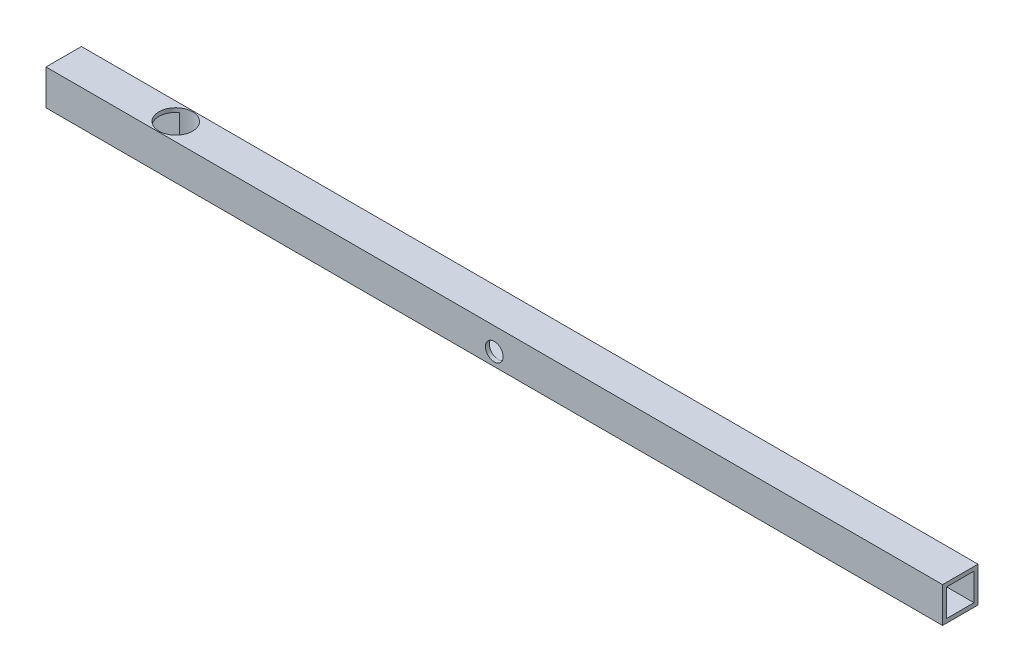
ISO-10303-21;
HEADER;
FILE_DESCRIPTION(('STEP AP214'),'2;1');
FILE_NAME('part.step','',(''),(''),'','','');
FILE_SCHEMA(('AUTOMOTIVE_DESIGN { 1 0 10303 214 1 1 1 1 }'));
ENDSEC;
DATA;
#1=APPLICATION_CONTEXT('core data for automotive mechanical design processes');
#2=APPLICATION_PROTOCOL_DEFINITION('international standard','automotive_design',2000,#1);
#3=PRODUCT_CONTEXT('',#1,'mechanical');
#4=PRODUCT('Part','Part','',(#3));
#5=PRODUCT_RELATED_PRODUCT_CATEGORY('part','',(#4));
#6=PRODUCT_DEFINITION_FORMATION('','',#4);
#7=PRODUCT_DEFINITION_CONTEXT('part definition',#1,'design');
#8=PRODUCT_DEFINITION('design','',#6,#7);
#9=PRODUCT_DEFINITION_SHAPE('','',#8);
#10=(LENGTH_UNIT() NAMED_UNIT(*) SI_UNIT(.MILLI.,.METRE.));
#11=(NAMED_UNIT(*) PLANE_ANGLE_UNIT() SI_UNIT($,.RADIAN.));
#12=(NAMED_UNIT(*) SI_UNIT($,.STERADIAN.) SOLID_ANGLE_UNIT());
#13=UNCERTAINTY_MEASURE_WITH_UNIT(LENGTH_MEASURE(1.E-05),#10,'distance_accuracy_value','');
#14=(GEOMETRIC_REPRESENTATION_CONTEXT(3) GLOBAL_UNCERTAINTY_ASSIGNED_CONTEXT((#13)) GLOBAL_UNIT_ASSIGNED_CONTEXT((#10,
#11,#12)) REPRESENTATION_CONTEXT('',''));
#15=CARTESIAN_POINT('',(0.,0.,0.));
#16=DIRECTION('',(0.,0.,1.));
#17=DIRECTION('',(1.,0.,0.));
#18=AXIS2_PLACEMENT_3D('',#15,#16,#17);
#19=CARTESIAN_POINT('',(80.,0.36,-0.36));
#20=DIRECTION('',(0.,0.,-1.));
#21=DIRECTION('',(-1.,0.,0.));
#22=AXIS2_PLACEMENT_3D('',#19,#20,#21);
#23=PLANE('',#22);
#24=DIRECTION('',(0.,1.,0.));
#25=VECTOR('',#24,1.);
#26=CARTESIAN_POINT('',(9.12730303082914,0.,-0.36));
#27=LINE('',#26,#25);
#28=CARTESIAN_POINT('',(9.12730303082914,0.36,-0.36));
#29=VERTEX_POINT('',#28);
#30=CARTESIAN_POINT('',(9.12730303082914,2.8,-0.36));
#31=VERTEX_POINT('',#30);
#32=EDGE_CURVE('E47',#29,#31,#27,.T.);
#33=ORIENTED_EDGE('',*,*,#32,.F.);
#34=DIRECTION('',(-1.,0.,0.));
#35=VECTOR('',#34,1.);
#36=CARTESIAN_POINT('',(80.,0.36,-0.36));
#37=LINE('',#36,#35);
#38=CARTESIAN_POINT('',(0.,0.36,-0.36));
#39=VERTEX_POINT('',#38);
#40=EDGE_CURVE('E152',#29,#39,#37,.T.);
#41=ORIENTED_EDGE('',*,*,#40,.T.);
#42=DIRECTION('',(0.,-1.,0.));
#43=VECTOR('',#42,1.);
#44=CARTESIAN_POINT('',(0.,0.36,-0.36));
#45=LINE('',#44,#43);
#46=CARTESIAN_POINT('',(0.,2.8,-0.36));
#47=VERTEX_POINT('',#46);
#48=EDGE_CURVE('E191',#47,#39,#45,.T.);
#49=ORIENTED_EDGE('',*,*,#48,.F.);
#50=DIRECTION('',(-1.,0.,0.));
#51=VECTOR('',#50,1.);
#52=CARTESIAN_POINT('',(80.,2.8,-0.36));
#53=LINE('',#52,#51);
#54=EDGE_CURVE('E145',#31,#47,#53,.T.);
#55=ORIENTED_EDGE('',*,*,#54,.F.);
#56=EDGE_LOOP('',(#33,#41,#49,#55));
#57=FACE_BOUND('',#56,.T.);
#58=ADVANCED_FACE('F32',(#57),#23,.T.);
#59=CARTESIAN_POINT('',(80.,0.36,-0.36));
#60=DIRECTION('',(0.,1.,0.));
#61=DIRECTION('',(0.,0.,1.));
#62=AXIS2_PLACEMENT_3D('',#59,#60,#61);
#63=PLANE('',#62);
#64=CARTESIAN_POINT('',(10.,0.36,-1.58));
#65=DIRECTION('',(0.,1.,0.));
#66=DIRECTION('',(0.,0.,1.));
#67=AXIS2_PLACEMENT_3D('',#64,#65,#66);
#68=CIRCLE('',#67,1.5);
#69=CARTESIAN_POINT('',(10.8726969691709,0.36,-0.36));
#70=VERTEX_POINT('',#69);
#71=CARTESIAN_POINT('',(10.8726969691709,0.36,-2.8));
#72=VERTEX_POINT('',#71);
#73=EDGE_CURVE('E227',#70,#72,#68,.T.);
#74=ORIENTED_EDGE('',*,*,#73,.F.);
#75=CARTESIAN_POINT('',(80.,0.36,-0.36));
#76=VERTEX_POINT('',#75);
#77=EDGE_CURVE('E153',#76,#70,#37,.T.);
#78=ORIENTED_EDGE('',*,*,#77,.F.);
#79=DIRECTION('',(0.,0.,-1.));
#80=VECTOR('',#79,1.);
#81=CARTESIAN_POINT('',(80.,0.36,-0.36));
#82=LINE('',#81,#80);
#83=CARTESIAN_POINT('',(80.,0.36,-2.8));
#84=VERTEX_POINT('',#83);
#85=EDGE_CURVE('E206',#76,#84,#82,.T.);
#86=ORIENTED_EDGE('',*,*,#85,.T.);
#87=DIRECTION('',(-1.,0.,0.));
#88=VECTOR('',#87,1.);
#89=CARTESIAN_POINT('',(80.,0.36,-2.8));
#90=LINE('',#89,#88);
#91=EDGE_CURVE('E149',#84,#72,#90,.T.);
#92=ORIENTED_EDGE('',*,*,#91,.T.);
#93=EDGE_LOOP('',(#74,#78,#86,#92));
#94=FACE_BOUND('',#93,.T.);
#95=ADVANCED_FACE('F235',(#94),#63,.T.);
#96=CARTESIAN_POINT('',(80.,0.36,-2.8));
#97=DIRECTION('',(0.,0.,1.));
#98=DIRECTION('',(1.,0.,0.));
#99=AXIS2_PLACEMENT_3D('',#96,#97,#98);
#100=PLANE('',#99);
#101=DIRECTION('',(0.,1.,0.));
#102=VECTOR('',#101,1.);
#103=CARTESIAN_POINT('',(10.8726969691709,0.,-2.8));
#104=LINE('',#103,#102);
#105=CARTESIAN_POINT('',(10.8726969691709,2.8,-2.8));
#106=VERTEX_POINT('',#105);
#107=EDGE_CURVE('E54',#72,#106,#104,.T.);
#108=ORIENTED_EDGE('',*,*,#107,.F.);
#109=ORIENTED_EDGE('',*,*,#91,.F.);
#110=DIRECTION('',(0.,1.,0.));
#111=VECTOR('',#110,1.);
#112=CARTESIAN_POINT('',(80.,0.36,-2.8));
#113=LINE('',#112,#111);
#114=CARTESIAN_POINT('',(80.,2.8,-2.8));
#115=VERTEX_POINT('',#114);
#116=EDGE_CURVE('E208',#84,#115,#113,.T.);
#117=ORIENTED_EDGE('',*,*,#116,.T.);
#118=DIRECTION('',(-1.,0.,0.));
#119=VECTOR('',#118,1.);
#120=CARTESIAN_POINT('',(80.,2.8,-2.8));
#121=LINE('',#120,#119);
#122=EDGE_CURVE('E140',#115,#106,#121,.T.);
#123=ORIENTED_EDGE('',*,*,#122,.T.);
#124=EDGE_LOOP('',(#108,#109,#117,#123));
#125=FACE_BOUND('',#124,.T.);
#126=CARTESIAN_POINT('',(40.,1.16,-2.8));
#127=DIRECTION('',(0.,0.,1.));
#128=DIRECTION('',(1.,0.,0.));
#129=AXIS2_PLACEMENT_3D('',#126,#127,#128);
#130=CIRCLE('',#129,0.79375);
#131=CARTESIAN_POINT('',(40.79375,1.16,-2.8));
#132=VERTEX_POINT('',#131);
#133=EDGE_CURVE('E184',#132,#132,#130,.T.);
#134=ORIENTED_EDGE('',*,*,#133,.F.);
#135=EDGE_LOOP('',(#134));
#136=FACE_BOUND('',#135,.T.);
#137=ADVANCED_FACE('F246',(#125,#136),#100,.T.);
#138=CARTESIAN_POINT('',(80.,2.8,-0.36));
#139=DIRECTION('',(0.,-1.,0.));
#140=DIRECTION('',(0.,0.,-1.));
#141=AXIS2_PLACEMENT_3D('',#138,#139,#140);
#142=PLANE('',#141);
#143=CARTESIAN_POINT('',(10.,2.8,-1.58));
#144=DIRECTION('',(0.,-1.,0.));
#145=DIRECTION('',(0.,0.,-1.));
#146=AXIS2_PLACEMENT_3D('',#143,#144,#145);
#147=CIRCLE('',#146,1.5);
#148=CARTESIAN_POINT('',(10.8726969691709,2.8,-0.36));
#149=VERTEX_POINT('',#148);
#150=EDGE_CURVE('E11',#106,#149,#147,.T.);
#151=ORIENTED_EDGE('',*,*,#150,.F.);
#152=ORIENTED_EDGE('',*,*,#122,.F.);
#153=DIRECTION('',(0.,0.,1.));
#154=VECTOR('',#153,1.);
#155=CARTESIAN_POINT('',(80.,2.8,-0.36));
#156=LINE('',#155,#154);
#157=CARTESIAN_POINT('',(80.,2.8,-0.36));
#158=VERTEX_POINT('',#157);
#159=EDGE_CURVE('E211',#115,#158,#156,.T.);
#160=ORIENTED_EDGE('',*,*,#159,.T.);
#161=EDGE_CURVE('E141',#158,#149,#53,.T.);
#162=ORIENTED_EDGE('',*,*,#161,.T.);
#163=EDGE_LOOP('',(#151,#152,#160,#162));
#164=FACE_BOUND('',#163,.T.);
#165=ADVANCED_FACE('F249',(#164),#142,.T.);
#166=CARTESIAN_POINT('',(80.,0.,0.));
#167=DIRECTION('',(-1.,0.,0.));
#168=DIRECTION('',(0.,0.,1.));
#169=AXIS2_PLACEMENT_3D('',#166,#167,#168);
#170=PLANE('',#169);
#171=DIRECTION('',(0.,-1.,0.));
#172=VECTOR('',#171,1.);
#173=CARTESIAN_POINT('',(80.,0.,0.));
#174=LINE('',#173,#172);
#175=CARTESIAN_POINT('',(80.,3.16,0.));
#176=VERTEX_POINT('',#175);
#177=CARTESIAN_POINT('',(80.,0.,0.));
#178=VERTEX_POINT('',#177);
#179=EDGE_CURVE('E157',#176,#178,#174,.T.);
#180=ORIENTED_EDGE('',*,*,#179,.T.);
#181=DIRECTION('',(0.,0.,-1.));
#182=VECTOR('',#181,1.);
#183=CARTESIAN_POINT('',(80.,0.,0.));
#184=LINE('',#183,#182);
#185=CARTESIAN_POINT('',(80.,0.,-3.16));
#186=VERTEX_POINT('',#185);
#187=EDGE_CURVE('E160',#178,#186,#184,.T.);
#188=ORIENTED_EDGE('',*,*,#187,.T.);
#189=DIRECTION('',(0.,1.,0.));
#190=VECTOR('',#189,1.);
#191=CARTESIAN_POINT('',(80.,0.,-3.16));
#192=LINE('',#191,#190);
#193=CARTESIAN_POINT('',(80.,3.16,-3.16));
#194=VERTEX_POINT('',#193);
#195=EDGE_CURVE('E163',#186,#194,#192,.T.);
#196=ORIENTED_EDGE('',*,*,#195,.T.);
#197=DIRECTION('',(0.,0.,1.));
#198=VECTOR('',#197,1.);
#199=CARTESIAN_POINT('',(80.,3.16,0.));
#200=LINE('',#199,#198);
#201=EDGE_CURVE('E165',#194,#176,#200,.T.);
#202=ORIENTED_EDGE('',*,*,#201,.T.);
#203=EDGE_LOOP('',(#180,#188,#196,#202));
#204=FACE_BOUND('',#203,.T.);
#205=DIRECTION('',(0.,-1.,0.));
#206=VECTOR('',#205,1.);
#207=CARTESIAN_POINT('',(80.,0.36,-0.36));
#208=LINE('',#207,#206);
#209=EDGE_CURVE('E204',#158,#76,#208,.T.);
#210=ORIENTED_EDGE('',*,*,#209,.F.);
#211=ORIENTED_EDGE('',*,*,#159,.F.);
#212=ORIENTED_EDGE('',*,*,#116,.F.);
#213=ORIENTED_EDGE('',*,*,#85,.F.);
#214=EDGE_LOOP('',(#210,#211,#212,#213));
#215=FACE_BOUND('',#214,.T.);
#216=ADVANCED_FACE('F243',(#204,#215),#170,.F.);
#217=CARTESIAN_POINT('',(0.,0.,0.));
#218=DIRECTION('',(-1.,0.,0.));
#219=DIRECTION('',(0.,0.,1.));
#220=AXIS2_PLACEMENT_3D('',#217,#218,#219);
#221=PLANE('',#220);
#222=DIRECTION('',(0.,-1.,0.));
#223=VECTOR('',#222,1.);
#224=CARTESIAN_POINT('',(0.,0.,0.));
#225=LINE('',#224,#223);
#226=CARTESIAN_POINT('',(0.,3.16,0.));
#227=VERTEX_POINT('',#226);
#228=CARTESIAN_POINT('',(0.,0.,0.));
#229=VERTEX_POINT('',#228);
#230=EDGE_CURVE('E156',#227,#229,#225,.T.);
#231=ORIENTED_EDGE('',*,*,#230,.F.);
#232=DIRECTION('',(0.,0.,1.));
#233=VECTOR('',#232,1.);
#234=CARTESIAN_POINT('',(0.,3.16,0.));
#235=LINE('',#234,#233);
#236=CARTESIAN_POINT('',(0.,3.16,-3.16));
#237=VERTEX_POINT('',#236);
#238=EDGE_CURVE('E161',#237,#227,#235,.T.);
#239=ORIENTED_EDGE('',*,*,#238,.F.);
#240=DIRECTION('',(0.,1.,0.));
#241=VECTOR('',#240,1.);
#242=CARTESIAN_POINT('',(0.,0.,-3.16));
#243=LINE('',#242,#241);
#244=CARTESIAN_POINT('',(0.,0.,-3.16));
#245=VERTEX_POINT('',#244);
#246=EDGE_CURVE('E172',#245,#237,#243,.T.);
#247=ORIENTED_EDGE('',*,*,#246,.F.);
#248=DIRECTION('',(0.,0.,-1.));
#249=VECTOR('',#248,1.);
#250=CARTESIAN_POINT('',(0.,0.,0.));
#251=LINE('',#250,#249);
#252=EDGE_CURVE('E170',#229,#245,#251,.T.);
#253=ORIENTED_EDGE('',*,*,#252,.F.);
#254=EDGE_LOOP('',(#231,#239,#247,#253));
#255=FACE_BOUND('',#254,.T.);
#256=DIRECTION('',(0.,0.,1.));
#257=VECTOR('',#256,1.);
#258=CARTESIAN_POINT('',(0.,2.8,-0.36));
#259=LINE('',#258,#257);
#260=CARTESIAN_POINT('',(0.,2.8,-2.8));
#261=VERTEX_POINT('',#260);
#262=EDGE_CURVE('E138',#261,#47,#259,.T.);
#263=ORIENTED_EDGE('',*,*,#262,.T.);
#264=ORIENTED_EDGE('',*,*,#48,.T.);
#265=DIRECTION('',(0.,0.,-1.));
#266=VECTOR('',#265,1.);
#267=CARTESIAN_POINT('',(0.,0.36,-0.36));
#268=LINE('',#267,#266);
#269=CARTESIAN_POINT('',(0.,0.36,-2.8));
#270=VERTEX_POINT('',#269);
#271=EDGE_CURVE('E215',#39,#270,#268,.T.);
#272=ORIENTED_EDGE('',*,*,#271,.T.);
#273=DIRECTION('',(0.,1.,0.));
#274=VECTOR('',#273,1.);
#275=CARTESIAN_POINT('',(0.,0.36,-2.8));
#276=LINE('',#275,#274);
#277=EDGE_CURVE('E218',#270,#261,#276,.T.);
#278=ORIENTED_EDGE('',*,*,#277,.T.);
#279=EDGE_LOOP('',(#263,#264,#272,#278));
#280=FACE_BOUND('',#279,.T.);
#281=ADVANCED_FACE('F220',(#255,#280),#221,.T.);
#282=CARTESIAN_POINT('',(80.,0.,0.));
#283=DIRECTION('',(0.,0.,-1.));
#284=DIRECTION('',(-1.,0.,0.));
#285=AXIS2_PLACEMENT_3D('',#282,#283,#284);
#286=PLANE('',#285);
#287=CARTESIAN_POINT('',(40.,1.16,0.));
#288=DIRECTION('',(0.,0.,1.));
#289=DIRECTION('',(1.,0.,0.));
#290=AXIS2_PLACEMENT_3D('',#287,#288,#289);
#291=CIRCLE('',#290,0.79375);
#292=CARTESIAN_POINT('',(40.79375,1.16,0.));
#293=VERTEX_POINT('',#292);
#294=EDGE_CURVE('E194',#293,#293,#291,.T.);
#295=ORIENTED_EDGE('',*,*,#294,.F.);
#296=EDGE_LOOP('',(#295));
#297=FACE_BOUND('',#296,.T.);
#298=ORIENTED_EDGE('',*,*,#230,.T.);
#299=DIRECTION('',(-1.,0.,0.));
#300=VECTOR('',#299,1.);
#301=CARTESIAN_POINT('',(80.,0.,0.));
#302=LINE('',#301,#300);
#303=EDGE_CURVE('E125',#178,#229,#302,.T.);
#304=ORIENTED_EDGE('',*,*,#303,.F.);
#305=ORIENTED_EDGE('',*,*,#179,.F.);
#306=DIRECTION('',(-1.,0.,0.));
#307=VECTOR('',#306,1.);
#308=CARTESIAN_POINT('',(80.,3.16,0.));
#309=LINE('',#308,#307);
#310=EDGE_CURVE('E167',#176,#227,#309,.T.);
#311=ORIENTED_EDGE('',*,*,#310,.T.);
#312=EDGE_LOOP('',(#298,#304,#305,#311));
#313=FACE_BOUND('',#312,.T.);
#314=ADVANCED_FACE('F34',(#297,#313),#286,.F.);
#315=CARTESIAN_POINT('',(80.,0.,0.));
#316=DIRECTION('',(0.,1.,0.));
#317=DIRECTION('',(0.,0.,1.));
#318=AXIS2_PLACEMENT_3D('',#315,#316,#317);
#319=PLANE('',#318);
#320=CARTESIAN_POINT('',(10.,0.,-1.58));
#321=DIRECTION('',(0.,1.,0.));
#322=DIRECTION('',(0.,0.,1.));
#323=AXIS2_PLACEMENT_3D('',#320,#321,#322);
#324=CIRCLE('',#323,1.5);
#325=CARTESIAN_POINT('',(10.,0.,-0.0799999999999978));
#326=VERTEX_POINT('',#325);
#327=EDGE_CURVE('E134',#326,#326,#324,.T.);
#328=ORIENTED_EDGE('',*,*,#327,.T.);
#329=EDGE_LOOP('',(#328));
#330=FACE_BOUND('',#329,.T.);
#331=ORIENTED_EDGE('',*,*,#252,.T.);
#332=DIRECTION('',(-1.,0.,0.));
#333=VECTOR('',#332,1.);
#334=CARTESIAN_POINT('',(80.,0.,-3.16));
#335=LINE('',#334,#333);
#336=EDGE_CURVE('E180',#186,#245,#335,.T.);
#337=ORIENTED_EDGE('',*,*,#336,.F.);
#338=ORIENTED_EDGE('',*,*,#187,.F.);
#339=ORIENTED_EDGE('',*,*,#303,.T.);
#340=EDGE_LOOP('',(#331,#337,#338,#339));
#341=FACE_BOUND('',#340,.T.);
#342=ADVANCED_FACE('F281',(#330,#341),#319,.F.);
#343=CARTESIAN_POINT('',(80.,0.,-3.16));
#344=DIRECTION('',(0.,0.,1.));
#345=DIRECTION('',(1.,0.,0.));
#346=AXIS2_PLACEMENT_3D('',#343,#344,#345);
#347=PLANE('',#346);
#348=CARTESIAN_POINT('',(40.,1.16,-3.16));
#349=DIRECTION('',(0.,0.,1.));
#350=DIRECTION('',(1.,0.,0.));
#351=AXIS2_PLACEMENT_3D('',#348,#349,#350);
#352=CIRCLE('',#351,0.79375);
#353=CARTESIAN_POINT('',(40.79375,1.16,-3.16));
#354=VERTEX_POINT('',#353);
#355=EDGE_CURVE('E187',#354,#354,#352,.T.);
#356=ORIENTED_EDGE('',*,*,#355,.T.);
#357=EDGE_LOOP('',(#356));
#358=FACE_BOUND('',#357,.T.);
#359=ORIENTED_EDGE('',*,*,#246,.T.);
#360=DIRECTION('',(-1.,0.,0.));
#361=VECTOR('',#360,1.);
#362=CARTESIAN_POINT('',(80.,3.16,-3.16));
#363=LINE('',#362,#361);
#364=EDGE_CURVE('E177',#194,#237,#363,.T.);
#365=ORIENTED_EDGE('',*,*,#364,.F.);
#366=ORIENTED_EDGE('',*,*,#195,.F.);
#367=ORIENTED_EDGE('',*,*,#336,.T.);
#368=EDGE_LOOP('',(#359,#365,#366,#367));
#369=FACE_BOUND('',#368,.T.);
#370=ADVANCED_FACE('F275',(#358,#369),#347,.F.);
#371=CARTESIAN_POINT('',(80.,3.16,0.));
#372=DIRECTION('',(0.,-1.,0.));
#373=DIRECTION('',(0.,0.,-1.));
#374=AXIS2_PLACEMENT_3D('',#371,#372,#373);
#375=PLANE('',#374);
#376=CARTESIAN_POINT('',(10.,3.16,-1.58));
#377=DIRECTION('',(0.,1.,0.));
#378=DIRECTION('',(0.,0.,1.));
#379=AXIS2_PLACEMENT_3D('',#376,#377,#378);
#380=CIRCLE('',#379,1.5);
#381=CARTESIAN_POINT('',(10.,3.16,-0.0799999999999978));
#382=VERTEX_POINT('',#381);
#383=EDGE_CURVE('E412',#382,#382,#380,.T.);
#384=ORIENTED_EDGE('',*,*,#383,.F.);
#385=EDGE_LOOP('',(#384));
#386=FACE_BOUND('',#385,.T.);
#387=ORIENTED_EDGE('',*,*,#238,.T.);
#388=ORIENTED_EDGE('',*,*,#310,.F.);
#389=ORIENTED_EDGE('',*,*,#201,.F.);
#390=ORIENTED_EDGE('',*,*,#364,.T.);
#391=EDGE_LOOP('',(#387,#388,#389,#390));
#392=FACE_BOUND('',#391,.T.);
#393=ADVANCED_FACE('F270',(#386,#392),#375,.F.);
#394=DIRECTION('',(0.,1.,0.));
#395=VECTOR('',#394,1.);
#396=CARTESIAN_POINT('',(10.8726969691709,0.,-0.36));
#397=LINE('',#396,#395);
#398=EDGE_CURVE('E199',#149,#70,#397,.F.);
#399=ORIENTED_EDGE('',*,*,#398,.F.);
#400=ORIENTED_EDGE('',*,*,#161,.F.);
#401=ORIENTED_EDGE('',*,*,#209,.T.);
#402=ORIENTED_EDGE('',*,*,#77,.T.);
#403=EDGE_LOOP('',(#399,#400,#401,#402));
#404=FACE_BOUND('',#403,.T.);
#405=CARTESIAN_POINT('',(40.,1.16,-0.36));
#406=DIRECTION('',(0.,0.,-1.));
#407=DIRECTION('',(-1.,0.,0.));
#408=AXIS2_PLACEMENT_3D('',#405,#406,#407);
#409=CIRCLE('',#408,0.79375);
#410=CARTESIAN_POINT('',(40.79375,1.16,-0.36));
#411=VERTEX_POINT('',#410);
#412=EDGE_CURVE('E186',#411,#411,#409,.T.);
#413=ORIENTED_EDGE('',*,*,#412,.F.);
#414=EDGE_LOOP('',(#413));
#415=FACE_BOUND('',#414,.T.);
#416=ADVANCED_FACE('F238',(#404,#415),#23,.T.);
#417=CARTESIAN_POINT('',(9.12730303082914,0.36,-2.8));
#418=VERTEX_POINT('',#417);
#419=EDGE_CURVE('E133',#418,#29,#68,.T.);
#420=ORIENTED_EDGE('',*,*,#419,.F.);
#421=EDGE_CURVE('E132',#418,#270,#90,.T.);
#422=ORIENTED_EDGE('',*,*,#421,.T.);
#423=ORIENTED_EDGE('',*,*,#271,.F.);
#424=ORIENTED_EDGE('',*,*,#40,.F.);
#425=EDGE_LOOP('',(#420,#422,#423,#424));
#426=FACE_BOUND('',#425,.T.);
#427=ADVANCED_FACE('F225',(#426),#63,.T.);
#428=DIRECTION('',(0.,1.,0.));
#429=VECTOR('',#428,1.);
#430=CARTESIAN_POINT('',(9.12730303082914,0.,-2.8));
#431=LINE('',#430,#429);
#432=CARTESIAN_POINT('',(9.12730303082914,2.8,-2.8));
#433=VERTEX_POINT('',#432);
#434=EDGE_CURVE('E120',#433,#418,#431,.F.);
#435=ORIENTED_EDGE('',*,*,#434,.F.);
#436=EDGE_CURVE('E130',#433,#261,#121,.T.);
#437=ORIENTED_EDGE('',*,*,#436,.T.);
#438=ORIENTED_EDGE('',*,*,#277,.F.);
#439=ORIENTED_EDGE('',*,*,#421,.F.);
#440=EDGE_LOOP('',(#435,#437,#438,#439));
#441=FACE_BOUND('',#440,.T.);
#442=ADVANCED_FACE('F128',(#441),#100,.T.);
#443=EDGE_CURVE('E36',#31,#433,#147,.T.);
#444=ORIENTED_EDGE('',*,*,#443,.F.);
#445=ORIENTED_EDGE('',*,*,#54,.T.);
#446=ORIENTED_EDGE('',*,*,#262,.F.);
#447=ORIENTED_EDGE('',*,*,#436,.F.);
#448=EDGE_LOOP('',(#444,#445,#446,#447));
#449=FACE_BOUND('',#448,.T.);
#450=ADVANCED_FACE('F136',(#449),#142,.T.);
#451=CARTESIAN_POINT('',(40.,1.16,-3.16));
#452=DIRECTION('',(0.,0.,1.));
#453=DIRECTION('',(1.,0.,0.));
#454=AXIS2_PLACEMENT_3D('',#451,#452,#453);
#455=CYLINDRICAL_SURFACE('',#454,0.79375);
#456=CARTESIAN_POINT('',(40.79375,1.16,-2.8));
#457=CARTESIAN_POINT('',(40.79375,1.16,-2.80375));
#458=CARTESIAN_POINT('',(40.79375,1.16,-2.8075));
#459=CARTESIAN_POINT('',(40.79375,1.16,-2.815));
#460=CARTESIAN_POINT('',(40.79375,1.16,-2.81875));
#461=CARTESIAN_POINT('',(40.79375,1.16,-2.82625));
#462=CARTESIAN_POINT('',(40.79375,1.16,-2.83));
#463=CARTESIAN_POINT('',(40.79375,1.16,-2.8375));
#464=CARTESIAN_POINT('',(40.79375,1.16,-2.84125));
#465=CARTESIAN_POINT('',(40.79375,1.16,-2.84875));
#466=CARTESIAN_POINT('',(40.79375,1.16,-2.8525));
#467=CARTESIAN_POINT('',(40.79375,1.16,-2.86));
#468=CARTESIAN_POINT('',(40.79375,1.16,-2.86375));
#469=CARTESIAN_POINT('',(40.79375,1.16,-2.87125));
#470=CARTESIAN_POINT('',(40.79375,1.16,-2.875));
#471=CARTESIAN_POINT('',(40.79375,1.16,-2.8825));
#472=CARTESIAN_POINT('',(40.79375,1.16,-2.88625));
#473=CARTESIAN_POINT('',(40.79375,1.16,-2.89375));
#474=CARTESIAN_POINT('',(40.79375,1.16,-2.8975));
#475=CARTESIAN_POINT('',(40.79375,1.16,-2.905));
#476=CARTESIAN_POINT('',(40.79375,1.16,-2.90875));
#477=CARTESIAN_POINT('',(40.79375,1.16,-2.91625));
#478=CARTESIAN_POINT('',(40.79375,1.16,-2.92));
#479=CARTESIAN_POINT('',(40.79375,1.16,-2.9275));
#480=CARTESIAN_POINT('',(40.79375,1.16,-2.93125));
#481=CARTESIAN_POINT('',(40.79375,1.16,-2.93875));
#482=CARTESIAN_POINT('',(40.79375,1.16,-2.9425));
#483=CARTESIAN_POINT('',(40.79375,1.16,-2.95));
#484=CARTESIAN_POINT('',(40.79375,1.16,-2.95375));
#485=CARTESIAN_POINT('',(40.79375,1.16,-2.96125));
#486=CARTESIAN_POINT('',(40.79375,1.16,-2.965));
#487=CARTESIAN_POINT('',(40.79375,1.16,-2.9725));
#488=CARTESIAN_POINT('',(40.79375,1.16,-2.97625));
#489=CARTESIAN_POINT('',(40.79375,1.16,-2.98375));
#490=CARTESIAN_POINT('',(40.79375,1.16,-2.9875));
#491=CARTESIAN_POINT('',(40.79375,1.16,-2.995));
#492=CARTESIAN_POINT('',(40.79375,1.16,-2.99875));
#493=CARTESIAN_POINT('',(40.79375,1.16,-3.00625));
#494=CARTESIAN_POINT('',(40.79375,1.16,-3.01));
#495=CARTESIAN_POINT('',(40.79375,1.16,-3.0175));
#496=CARTESIAN_POINT('',(40.79375,1.16,-3.02125));
#497=CARTESIAN_POINT('',(40.79375,1.16,-3.02875));
#498=CARTESIAN_POINT('',(40.79375,1.16,-3.0325));
#499=CARTESIAN_POINT('',(40.79375,1.16,-3.04));
#500=CARTESIAN_POINT('',(40.79375,1.16,-3.04375));
#501=CARTESIAN_POINT('',(40.79375,1.16,-3.05125));
#502=CARTESIAN_POINT('',(40.79375,1.16,-3.055));
#503=CARTESIAN_POINT('',(40.79375,1.16,-3.0625));
#504=CARTESIAN_POINT('',(40.79375,1.16,-3.06625));
#505=CARTESIAN_POINT('',(40.79375,1.16,-3.07375));
#506=CARTESIAN_POINT('',(40.79375,1.16,-3.0775));
#507=CARTESIAN_POINT('',(40.79375,1.16,-3.085));
#508=CARTESIAN_POINT('',(40.79375,1.16,-3.08875));
#509=CARTESIAN_POINT('',(40.79375,1.16,-3.09625));
#510=CARTESIAN_POINT('',(40.79375,1.16,-3.1));
#511=CARTESIAN_POINT('',(40.79375,1.16,-3.1075));
#512=CARTESIAN_POINT('',(40.79375,1.16,-3.11125));
#513=CARTESIAN_POINT('',(40.79375,1.16,-3.11875));
#514=CARTESIAN_POINT('',(40.79375,1.16,-3.1225));
#515=CARTESIAN_POINT('',(40.79375,1.16,-3.13));
#516=CARTESIAN_POINT('',(40.79375,1.16,-3.13375));
#517=CARTESIAN_POINT('',(40.79375,1.16,-3.14125));
#518=CARTESIAN_POINT('',(40.79375,1.16,-3.145));
#519=CARTESIAN_POINT('',(40.79375,1.16,-3.1525));
#520=CARTESIAN_POINT('',(40.79375,1.16,-3.15625));
#521=CARTESIAN_POINT('',(40.79375,1.16,-3.16));
#522=B_SPLINE_CURVE_WITH_KNOTS('',3,(#456,#457,#458,#459,#460,#461,#462,#463,#464,#465,#466,
#467,#468,#469,#470,#471,#472,#473,#474,#475,#476,#477,#478,#479,#480,#481,#482,#483,#484,#485,
#486,#487,#488,#489,#490,#491,#492,#493,#494,#495,#496,#497,#498,#499,#500,#501,#502,#503,#504,
#505,#506,#507,#508,#509,#510,#511,#512,#513,#514,#515,#516,#517,#518,#519,#520,#521),
.UNSPECIFIED.,.F.,.F.,(4,2,2,2,2,2,2,2,2,2,2,2,2,2,2,2,2,2,2,2,2,2,2,2,2,2,2,2,2,2,2,2,4),(0.,
0.0112500000000004,0.0225000000000004,0.0337500000000004,0.0450000000000003,0.0562500000000003,
0.0675000000000003,0.0787500000000003,0.0900000000000002,0.10125,0.1125,0.12375,0.135,0.14625,
0.1575,0.16875,0.18,0.19125,0.2025,0.21375,0.225,0.23625,0.2475,0.25875,0.27,0.28125,0.2925,
0.30375,0.315,0.32625,0.3375,0.34875,0.36),.UNSPECIFIED.);
#523=EDGE_CURVE('BSEAM261',#132,#354,#522,.T.);
#524=ORIENTED_EDGE('',*,*,#133,.T.);
#525=ORIENTED_EDGE('',*,*,#355,.F.);
#526=ORIENTED_EDGE('',*,*,#523,.T.);
#527=ORIENTED_EDGE('',*,*,#523,.F.);
#528=EDGE_LOOP('',(#524,#526,#525,#527));
#529=FACE_BOUND('',#528,.T.);
#530=ADVANCED_FACE('F261',(#529),#455,.F.);
#531=CARTESIAN_POINT('',(40.79375,1.16,-0.36));
#532=CARTESIAN_POINT('',(40.79375,1.16,-0.35625));
#533=CARTESIAN_POINT('',(40.79375,1.16,-0.3525));
#534=CARTESIAN_POINT('',(40.79375,1.16,-0.345));
#535=CARTESIAN_POINT('',(40.79375,1.16,-0.34125));
#536=CARTESIAN_POINT('',(40.79375,1.16,-0.33375));
#537=CARTESIAN_POINT('',(40.79375,1.16,-0.33));
#538=CARTESIAN_POINT('',(40.79375,1.16,-0.3225));
#539=CARTESIAN_POINT('',(40.79375,1.16,-0.31875));
#540=CARTESIAN_POINT('',(40.79375,1.16,-0.31125));
#541=CARTESIAN_POINT('',(40.79375,1.16,-0.3075));
#542=CARTESIAN_POINT('',(40.79375,1.16,-0.3));
#543=CARTESIAN_POINT('',(40.79375,1.16,-0.29625));
#544=CARTESIAN_POINT('',(40.79375,1.16,-0.28875));
#545=CARTESIAN_POINT('',(40.79375,1.16,-0.285));
#546=CARTESIAN_POINT('',(40.79375,1.16,-0.2775));
#547=CARTESIAN_POINT('',(40.79375,1.16,-0.27375));
#548=CARTESIAN_POINT('',(40.79375,1.16,-0.26625));
#549=CARTESIAN_POINT('',(40.79375,1.16,-0.2625));
#550=CARTESIAN_POINT('',(40.79375,1.16,-0.255));
#551=CARTESIAN_POINT('',(40.79375,1.16,-0.25125));
#552=CARTESIAN_POINT('',(40.79375,1.16,-0.24375));
#553=CARTESIAN_POINT('',(40.79375,1.16,-0.24));
#554=CARTESIAN_POINT('',(40.79375,1.16,-0.2325));
#555=CARTESIAN_POINT('',(40.79375,1.16,-0.22875));
#556=CARTESIAN_POINT('',(40.79375,1.16,-0.22125));
#557=CARTESIAN_POINT('',(40.79375,1.16,-0.2175));
#558=CARTESIAN_POINT('',(40.79375,1.16,-0.21));
#559=CARTESIAN_POINT('',(40.79375,1.16,-0.20625));
#560=CARTESIAN_POINT('',(40.79375,1.16,-0.19875));
#561=CARTESIAN_POINT('',(40.79375,1.16,-0.195));
#562=CARTESIAN_POINT('',(40.79375,1.16,-0.1875));
#563=CARTESIAN_POINT('',(40.79375,1.16,-0.18375));
#564=CARTESIAN_POINT('',(40.79375,1.16,-0.17625));
#565=CARTESIAN_POINT('',(40.79375,1.16,-0.1725));
#566=CARTESIAN_POINT('',(40.79375,1.16,-0.165));
#567=CARTESIAN_POINT('',(40.79375,1.16,-0.16125));
#568=CARTESIAN_POINT('',(40.79375,1.16,-0.15375));
#569=CARTESIAN_POINT('',(40.79375,1.16,-0.15));
#570=CARTESIAN_POINT('',(40.79375,1.16,-0.1425));
#571=CARTESIAN_POINT('',(40.79375,1.16,-0.13875));
#572=CARTESIAN_POINT('',(40.79375,1.16,-0.13125));
#573=CARTESIAN_POINT('',(40.79375,1.16,-0.1275));
#574=CARTESIAN_POINT('',(40.79375,1.16,-0.12));
#575=CARTESIAN_POINT('',(40.79375,1.16,-0.11625));
#576=CARTESIAN_POINT('',(40.79375,1.16,-0.10875));
#577=CARTESIAN_POINT('',(40.79375,1.16,-0.105));
#578=CARTESIAN_POINT('',(40.79375,1.16,-0.0974999999999998));
#579=CARTESIAN_POINT('',(40.79375,1.16,-0.0937499999999998));
#580=CARTESIAN_POINT('',(40.79375,1.16,-0.0862499999999998));
#581=CARTESIAN_POINT('',(40.79375,1.16,-0.0824999999999998));
#582=CARTESIAN_POINT('',(40.79375,1.16,-0.0749999999999998));
#583=CARTESIAN_POINT('',(40.79375,1.16,-0.0712499999999998));
#584=CARTESIAN_POINT('',(40.79375,1.16,-0.0637499999999999));
#585=CARTESIAN_POINT('',(40.79375,1.16,-0.0599999999999999));
#586=CARTESIAN_POINT('',(40.79375,1.16,-0.0524999999999999));
#587=CARTESIAN_POINT('',(40.79375,1.16,-0.0487499999999999));
#588=CARTESIAN_POINT('',(40.79375,1.16,-0.0412499999999999));
#589=CARTESIAN_POINT('',(40.79375,1.16,-0.0374999999999999));
#590=CARTESIAN_POINT('',(40.79375,1.16,-0.0299999999999999));
#591=CARTESIAN_POINT('',(40.79375,1.16,-0.0262499999999999));
#592=CARTESIAN_POINT('',(40.79375,1.16,-0.01875));
#593=CARTESIAN_POINT('',(40.79375,1.16,-0.015));
#594=CARTESIAN_POINT('',(40.79375,1.16,-0.00749999999999998));
#595=CARTESIAN_POINT('',(40.79375,1.16,-0.00374999999999999));
#596=CARTESIAN_POINT('',(40.79375,1.16,0.));
#597=B_SPLINE_CURVE_WITH_KNOTS('',3,(#531,#532,#533,#534,#535,#536,#537,#538,#539,#540,#541,
#542,#543,#544,#545,#546,#547,#548,#549,#550,#551,#552,#553,#554,#555,#556,#557,#558,#559,#560,
#561,#562,#563,#564,#565,#566,#567,#568,#569,#570,#571,#572,#573,#574,#575,#576,#577,#578,#579,
#580,#581,#582,#583,#584,#585,#586,#587,#588,#589,#590,#591,#592,#593,#594,#595,#596),
.UNSPECIFIED.,.F.,.F.,(4,2,2,2,2,2,2,2,2,2,2,2,2,2,2,2,2,2,2,2,2,2,2,2,2,2,2,2,2,2,2,2,4),(0.,
0.01125,0.0225,0.0337499999999999,0.0449999999999999,0.0562499999999999,0.0674999999999999,
0.0787499999999998,0.0899999999999998,0.10125,0.1125,0.12375,0.135,0.14625,0.1575,0.16875,0.18,
0.19125,0.2025,0.21375,0.225,0.23625,0.2475,0.25875,0.27,0.28125,0.2925,0.30375,0.315,0.32625,
0.3375,0.34875,0.36),.UNSPECIFIED.);
#598=EDGE_CURVE('BSEAM334',#411,#293,#597,.T.);
#599=ORIENTED_EDGE('',*,*,#412,.T.);
#600=ORIENTED_EDGE('',*,*,#294,.T.);
#601=ORIENTED_EDGE('',*,*,#598,.T.);
#602=ORIENTED_EDGE('',*,*,#598,.F.);
#603=EDGE_LOOP('',(#599,#601,#600,#602));
#604=FACE_BOUND('',#603,.T.);
#605=ADVANCED_FACE('F334',(#604),#455,.F.);
#606=CARTESIAN_POINT('',(10.,0.,-1.58));
#607=DIRECTION('',(0.,1.,0.));
#608=DIRECTION('',(0.,0.,1.));
#609=AXIS2_PLACEMENT_3D('',#606,#607,#608);
#610=CYLINDRICAL_SURFACE('',#609,1.5);
#611=ORIENTED_EDGE('',*,*,#398,.T.);
#612=ORIENTED_EDGE('',*,*,#73,.T.);
#613=ORIENTED_EDGE('',*,*,#107,.T.);
#614=ORIENTED_EDGE('',*,*,#150,.T.);
#615=EDGE_LOOP('',(#611,#612,#613,#614));
#616=FACE_BOUND('',#615,.T.);
#617=ORIENTED_EDGE('',*,*,#32,.T.);
#618=ORIENTED_EDGE('',*,*,#443,.T.);
#619=ORIENTED_EDGE('',*,*,#434,.T.);
#620=ORIENTED_EDGE('',*,*,#419,.T.);
#621=EDGE_LOOP('',(#617,#618,#619,#620));
#622=FACE_BOUND('',#621,.T.);
#623=ORIENTED_EDGE('',*,*,#327,.F.);
#624=EDGE_LOOP('',(#623));
#625=FACE_BOUND('',#624,.T.);
#626=ORIENTED_EDGE('',*,*,#383,.T.);
#627=EDGE_LOOP('',(#626));
#628=FACE_BOUND('',#627,.T.);
#629=ADVANCED_FACE('F118',(#616,#622,#625,#628),#610,.F.);
#630=CLOSED_SHELL('',(#58,#95,#137,#165,#216,#281,#314,#342,#370,#393,#416,#427,#442,#450,#530,
#605,#629));
#631=MANIFOLD_SOLID_BREP('B2',#630);
#632=ADVANCED_BREP_SHAPE_REPRESENTATION('',(#18,#631),#14);
#633=SHAPE_DEFINITION_REPRESENTATION(#9,#632);
ENDSEC;
END-ISO-10303-21;
